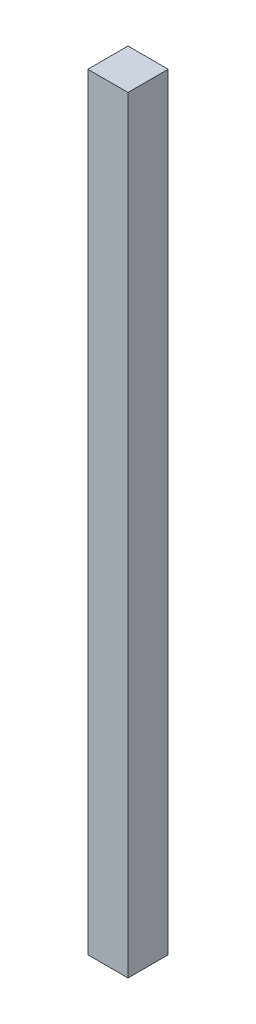
ISO-10303-21;
HEADER;
FILE_DESCRIPTION(('STEP AP214'),'2;1');
FILE_NAME('part.step','',(''),(''),'','','');
FILE_SCHEMA(('AUTOMOTIVE_DESIGN { 1 0 10303 214 1 1 1 1 }'));
ENDSEC;
DATA;
#1=APPLICATION_CONTEXT('core data for automotive mechanical design processes');
#2=APPLICATION_PROTOCOL_DEFINITION('international standard','automotive_design',2000,#1);
#3=PRODUCT_CONTEXT('',#1,'mechanical');
#4=PRODUCT('Part','Part','',(#3));
#5=PRODUCT_RELATED_PRODUCT_CATEGORY('part','',(#4));
#6=PRODUCT_DEFINITION_FORMATION('','',#4);
#7=PRODUCT_DEFINITION_CONTEXT('part definition',#1,'design');
#8=PRODUCT_DEFINITION('design','',#6,#7);
#9=PRODUCT_DEFINITION_SHAPE('','',#8);
#10=(LENGTH_UNIT() NAMED_UNIT(*) SI_UNIT(.MILLI.,.METRE.));
#11=(NAMED_UNIT(*) PLANE_ANGLE_UNIT() SI_UNIT($,.RADIAN.));
#12=(NAMED_UNIT(*) SI_UNIT($,.STERADIAN.) SOLID_ANGLE_UNIT());
#13=UNCERTAINTY_MEASURE_WITH_UNIT(LENGTH_MEASURE(1.E-05),#10,'distance_accuracy_value','');
#14=(GEOMETRIC_REPRESENTATION_CONTEXT(3) GLOBAL_UNCERTAINTY_ASSIGNED_CONTEXT((#13)) GLOBAL_UNIT_ASSIGNED_CONTEXT((#10,
#11,#12)) REPRESENTATION_CONTEXT('',''));
#15=CARTESIAN_POINT('',(0.,0.,0.));
#16=DIRECTION('',(0.,0.,1.));
#17=DIRECTION('',(1.,0.,0.));
#18=AXIS2_PLACEMENT_3D('',#15,#16,#17);
#19=CARTESIAN_POINT('',(44.45,0.,-44.45));
#20=DIRECTION('',(0.,0.,-1.));
#21=DIRECTION('',(-1.,0.,0.));
#22=AXIS2_PLACEMENT_3D('',#19,#20,#21);
#23=PLANE('',#22);
#24=DIRECTION('',(1.,0.,0.));
#25=VECTOR('',#24,1.);
#26=CARTESIAN_POINT('',(0.,847.725,-44.45));
#27=LINE('',#26,#25);
#28=CARTESIAN_POINT('',(44.45,847.725,-44.45));
#29=VERTEX_POINT('',#28);
#30=CARTESIAN_POINT('',(0.,847.725,-44.45));
#31=VERTEX_POINT('',#30);
#32=EDGE_CURVE('E84',#29,#31,#27,.F.);
#33=ORIENTED_EDGE('',*,*,#32,.F.);
#34=DIRECTION('',(0.,1.,0.));
#35=VECTOR('',#34,1.);
#36=CARTESIAN_POINT('',(44.45,0.,-44.45));
#37=LINE('',#36,#35);
#38=CARTESIAN_POINT('',(44.45,0.,-44.45));
#39=VERTEX_POINT('',#38);
#40=EDGE_CURVE('E71',#39,#29,#37,.T.);
#41=ORIENTED_EDGE('',*,*,#40,.F.);
#42=DIRECTION('',(1.,0.,0.));
#43=VECTOR('',#42,1.);
#44=CARTESIAN_POINT('',(0.,0.,-44.45));
#45=LINE('',#44,#43);
#46=CARTESIAN_POINT('',(0.,0.,-44.45));
#47=VERTEX_POINT('',#46);
#48=EDGE_CURVE('E36',#39,#47,#45,.F.);
#49=ORIENTED_EDGE('',*,*,#48,.T.);
#50=DIRECTION('',(0.,1.,0.));
#51=VECTOR('',#50,1.);
#52=CARTESIAN_POINT('',(0.,0.,-44.45));
#53=LINE('',#52,#51);
#54=EDGE_CURVE('E97',#31,#47,#53,.F.);
#55=ORIENTED_EDGE('',*,*,#54,.F.);
#56=EDGE_LOOP('',(#33,#41,#49,#55));
#57=FACE_BOUND('',#56,.T.);
#58=ADVANCED_FACE('F33',(#57),#23,.T.);
#59=CARTESIAN_POINT('',(0.,0.,0.));
#60=DIRECTION('',(0.,1.,0.));
#61=DIRECTION('',(0.,0.,1.));
#62=AXIS2_PLACEMENT_3D('',#59,#60,#61);
#63=PLANE('',#62);
#64=DIRECTION('',(0.,0.,1.));
#65=VECTOR('',#64,1.);
#66=CARTESIAN_POINT('',(0.,0.,-44.45));
#67=LINE('',#66,#65);
#68=CARTESIAN_POINT('',(0.,0.,0.));
#69=VERTEX_POINT('',#68);
#70=EDGE_CURVE('E80',#47,#69,#67,.T.);
#71=ORIENTED_EDGE('',*,*,#70,.F.);
#72=ORIENTED_EDGE('',*,*,#48,.F.);
#73=DIRECTION('',(0.,0.,-1.));
#74=VECTOR('',#73,1.);
#75=CARTESIAN_POINT('',(44.45,0.,0.));
#76=LINE('',#75,#74);
#77=CARTESIAN_POINT('',(44.45,0.,0.));
#78=VERTEX_POINT('',#77);
#79=EDGE_CURVE('E77',#78,#39,#76,.T.);
#80=ORIENTED_EDGE('',*,*,#79,.F.);
#81=DIRECTION('',(1.,0.,0.));
#82=VECTOR('',#81,1.);
#83=CARTESIAN_POINT('',(0.,0.,0.));
#84=LINE('',#83,#82);
#85=EDGE_CURVE('E99',#69,#78,#84,.T.);
#86=ORIENTED_EDGE('',*,*,#85,.F.);
#87=EDGE_LOOP('',(#71,#72,#80,#86));
#88=FACE_BOUND('',#87,.T.);
#89=ADVANCED_FACE('F76',(#88),#63,.F.);
#90=CARTESIAN_POINT('',(44.45,0.,0.));
#91=DIRECTION('',(1.,0.,0.));
#92=DIRECTION('',(0.,0.,-1.));
#93=AXIS2_PLACEMENT_3D('',#90,#91,#92);
#94=PLANE('',#93);
#95=DIRECTION('',(0.,0.,1.));
#96=VECTOR('',#95,1.);
#97=CARTESIAN_POINT('',(44.45,847.725,0.));
#98=LINE('',#97,#96);
#99=CARTESIAN_POINT('',(44.45,847.725,0.));
#100=VERTEX_POINT('',#99);
#101=EDGE_CURVE('E86',#100,#29,#98,.F.);
#102=ORIENTED_EDGE('',*,*,#101,.F.);
#103=DIRECTION('',(0.,1.,0.));
#104=VECTOR('',#103,1.);
#105=CARTESIAN_POINT('',(44.45,0.,0.));
#106=LINE('',#105,#104);
#107=EDGE_CURVE('E90',#78,#100,#106,.T.);
#108=ORIENTED_EDGE('',*,*,#107,.F.);
#109=ORIENTED_EDGE('',*,*,#79,.T.);
#110=ORIENTED_EDGE('',*,*,#40,.T.);
#111=EDGE_LOOP('',(#102,#108,#109,#110));
#112=FACE_BOUND('',#111,.T.);
#113=ADVANCED_FACE('F88',(#112),#94,.T.);
#114=CARTESIAN_POINT('',(0.,847.725,0.));
#115=DIRECTION('',(0.,1.,0.));
#116=DIRECTION('',(0.,0.,1.));
#117=AXIS2_PLACEMENT_3D('',#114,#115,#116);
#118=PLANE('',#117);
#119=ORIENTED_EDGE('',*,*,#32,.T.);
#120=DIRECTION('',(0.,0.,1.));
#121=VECTOR('',#120,1.);
#122=CARTESIAN_POINT('',(0.,847.725,-44.45));
#123=LINE('',#122,#121);
#124=CARTESIAN_POINT('',(0.,847.725,0.));
#125=VERTEX_POINT('',#124);
#126=EDGE_CURVE('E51',#125,#31,#123,.F.);
#127=ORIENTED_EDGE('',*,*,#126,.F.);
#128=DIRECTION('',(1.,0.,0.));
#129=VECTOR('',#128,1.);
#130=CARTESIAN_POINT('',(0.,847.725,0.));
#131=LINE('',#130,#129);
#132=EDGE_CURVE('E42',#100,#125,#131,.F.);
#133=ORIENTED_EDGE('',*,*,#132,.F.);
#134=ORIENTED_EDGE('',*,*,#101,.T.);
#135=EDGE_LOOP('',(#119,#127,#133,#134));
#136=FACE_BOUND('',#135,.T.);
#137=ADVANCED_FACE('F105',(#136),#118,.T.);
#138=CARTESIAN_POINT('',(0.,0.,-44.45));
#139=DIRECTION('',(-1.,0.,0.));
#140=DIRECTION('',(0.,0.,1.));
#141=AXIS2_PLACEMENT_3D('',#138,#139,#140);
#142=PLANE('',#141);
#143=ORIENTED_EDGE('',*,*,#126,.T.);
#144=ORIENTED_EDGE('',*,*,#54,.T.);
#145=ORIENTED_EDGE('',*,*,#70,.T.);
#146=DIRECTION('',(0.,1.,0.));
#147=VECTOR('',#146,1.);
#148=CARTESIAN_POINT('',(0.,0.,0.));
#149=LINE('',#148,#147);
#150=EDGE_CURVE('E11',#125,#69,#149,.F.);
#151=ORIENTED_EDGE('',*,*,#150,.F.);
#152=EDGE_LOOP('',(#143,#144,#145,#151));
#153=FACE_BOUND('',#152,.T.);
#154=ADVANCED_FACE('F107',(#153),#142,.T.);
#155=CARTESIAN_POINT('',(0.,0.,0.));
#156=DIRECTION('',(0.,0.,1.));
#157=DIRECTION('',(1.,0.,0.));
#158=AXIS2_PLACEMENT_3D('',#155,#156,#157);
#159=PLANE('',#158);
#160=ORIENTED_EDGE('',*,*,#132,.T.);
#161=ORIENTED_EDGE('',*,*,#150,.T.);
#162=ORIENTED_EDGE('',*,*,#85,.T.);
#163=ORIENTED_EDGE('',*,*,#107,.T.);
#164=EDGE_LOOP('',(#160,#161,#162,#163));
#165=FACE_BOUND('',#164,.T.);
#166=ADVANCED_FACE('F104',(#165),#159,.T.);
#167=CLOSED_SHELL('',(#58,#89,#113,#137,#154,#166));
#168=MANIFOLD_SOLID_BREP('B2',#167);
#169=ADVANCED_BREP_SHAPE_REPRESENTATION('',(#18,#168),#14);
#170=SHAPE_DEFINITION_REPRESENTATION(#9,#169);
ENDSEC;
END-ISO-10303-21;
